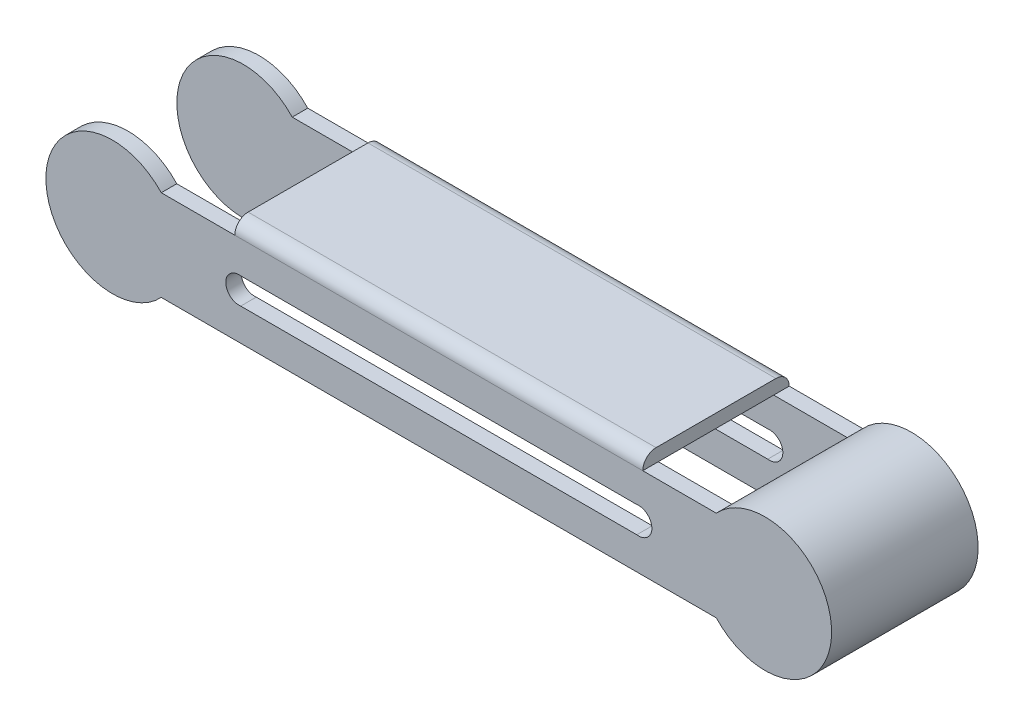
ISO-10303-21;
HEADER;
FILE_DESCRIPTION(('STEP AP214'),'2;1');
FILE_NAME('part.step','',(''),(''),'','','');
FILE_SCHEMA(('AUTOMOTIVE_DESIGN { 1 0 10303 214 1 1 1 1 }'));
ENDSEC;
DATA;
#1=APPLICATION_CONTEXT('core data for automotive mechanical design processes');
#2=APPLICATION_PROTOCOL_DEFINITION('international standard','automotive_design',2000,#1);
#3=PRODUCT_CONTEXT('',#1,'mechanical');
#4=PRODUCT('Part','Part','',(#3));
#5=PRODUCT_RELATED_PRODUCT_CATEGORY('part','',(#4));
#6=PRODUCT_DEFINITION_FORMATION('','',#4);
#7=PRODUCT_DEFINITION_CONTEXT('part definition',#1,'design');
#8=PRODUCT_DEFINITION('design','',#6,#7);
#9=PRODUCT_DEFINITION_SHAPE('','',#8);
#10=(LENGTH_UNIT() NAMED_UNIT(*) SI_UNIT(.MILLI.,.METRE.));
#11=(NAMED_UNIT(*) PLANE_ANGLE_UNIT() SI_UNIT($,.RADIAN.));
#12=(NAMED_UNIT(*) SI_UNIT($,.STERADIAN.) SOLID_ANGLE_UNIT());
#13=UNCERTAINTY_MEASURE_WITH_UNIT(LENGTH_MEASURE(1.E-05),#10,'distance_accuracy_value','');
#14=(GEOMETRIC_REPRESENTATION_CONTEXT(3) GLOBAL_UNCERTAINTY_ASSIGNED_CONTEXT((#13)) GLOBAL_UNIT_ASSIGNED_CONTEXT((#10,
#11,#12)) REPRESENTATION_CONTEXT('',''));
#15=CARTESIAN_POINT('',(0.,0.,0.));
#16=DIRECTION('',(0.,0.,1.));
#17=DIRECTION('',(1.,0.,0.));
#18=AXIS2_PLACEMENT_3D('',#15,#16,#17);
#19=CARTESIAN_POINT('',(73.5,0.,0.));
#20=DIRECTION('',(0.,0.,1.));
#21=DIRECTION('',(1.,0.,0.));
#22=AXIS2_PLACEMENT_3D('',#19,#20,#21);
#23=PLANE('',#22);
#24=DIRECTION('',(-1.,0.,0.));
#25=VECTOR('',#24,1.);
#26=CARTESIAN_POINT('',(73.5,2.95,0.));
#27=LINE('',#26,#25);
#28=CARTESIAN_POINT('',(44.6061096592177,2.95,0.));
#29=VERTEX_POINT('',#28);
#30=CARTESIAN_POINT('',(-44.6061096592177,2.95,0.));
#31=VERTEX_POINT('',#30);
#32=EDGE_CURVE('E283',#29,#31,#27,.T.);
#33=ORIENTED_EDGE('',*,*,#32,.T.);
#34=CARTESIAN_POINT('',(-45.,0.,0.));
#35=DIRECTION('',(0.,0.,1.));
#36=DIRECTION('',(1.,0.,0.));
#37=AXIS2_PLACEMENT_3D('',#34,#35,#36);
#38=CIRCLE('',#37,2.97618037097244);
#39=CARTESIAN_POINT('',(-44.6061096592177,-2.95,0.));
#40=VERTEX_POINT('',#39);
#41=EDGE_CURVE('E279',#31,#40,#38,.T.);
#42=ORIENTED_EDGE('',*,*,#41,.T.);
#43=DIRECTION('',(1.,0.,0.));
#44=VECTOR('',#43,1.);
#45=CARTESIAN_POINT('',(73.5,-2.95,0.));
#46=LINE('',#45,#44);
#47=CARTESIAN_POINT('',(44.6061096592177,-2.95,0.));
#48=VERTEX_POINT('',#47);
#49=EDGE_CURVE('E291',#40,#48,#46,.T.);
#50=ORIENTED_EDGE('',*,*,#49,.T.);
#51=CARTESIAN_POINT('',(45.0278915933969,0.,0.));
#52=DIRECTION('',(0.,0.,1.));
#53=DIRECTION('',(1.,0.,0.));
#54=AXIS2_PLACEMENT_3D('',#51,#52,#53);
#55=CIRCLE('',#54,2.98);
#56=EDGE_CURVE('E287',#48,#29,#55,.T.);
#57=ORIENTED_EDGE('',*,*,#56,.T.);
#58=EDGE_LOOP('',(#33,#42,#50,#57));
#59=FACE_BOUND('',#58,.T.);
#60=DIRECTION('',(-1.,0.,0.));
#61=VECTOR('',#60,1.);
#62=CARTESIAN_POINT('',(73.5,10.2119473962557,0.));
#63=LINE('',#62,#61);
#64=CARTESIAN_POINT('',(45.9493952932151,10.2119473962557,0.));
#65=VERTEX_POINT('',#64);
#66=CARTESIAN_POINT('',(-45.9493952932151,10.2119473962557,0.));
#67=VERTEX_POINT('',#66);
#68=EDGE_CURVE('E195',#65,#67,#63,.T.);
#69=ORIENTED_EDGE('',*,*,#68,.F.);
#70=DIRECTION('',(-1.,0.,0.));
#71=VECTOR('',#70,1.);
#72=CARTESIAN_POINT('',(-62.5129107414154,10.2119473962557,0.));
#73=LINE('',#72,#71);
#74=CARTESIAN_POINT('',(62.5129107414154,10.2119473962557,0.));
#75=VERTEX_POINT('',#74);
#76=EDGE_CURVE('E199',#75,#65,#73,.T.);
#77=ORIENTED_EDGE('',*,*,#76,.F.);
#78=CARTESIAN_POINT('',(73.5,0.,0.));
#79=DIRECTION('',(0.,0.,1.));
#80=DIRECTION('',(1.,0.,0.));
#81=AXIS2_PLACEMENT_3D('',#78,#79,#80);
#82=CIRCLE('',#81,15.);
#83=CARTESIAN_POINT('',(62.5129107414154,-10.2119473962557,0.));
#84=VERTEX_POINT('',#83);
#85=EDGE_CURVE('E321',#84,#75,#82,.T.);
#86=ORIENTED_EDGE('',*,*,#85,.F.);
#87=DIRECTION('',(1.,0.,0.));
#88=VECTOR('',#87,1.);
#89=CARTESIAN_POINT('',(-62.5129107414154,-10.2119473962557,0.));
#90=LINE('',#89,#88);
#91=CARTESIAN_POINT('',(-62.5129107414154,-10.2119473962557,0.));
#92=VERTEX_POINT('',#91);
#93=EDGE_CURVE('E314',#92,#84,#90,.T.);
#94=ORIENTED_EDGE('',*,*,#93,.F.);
#95=CARTESIAN_POINT('',(-73.5,0.,0.));
#96=DIRECTION('',(0.,0.,1.));
#97=DIRECTION('',(1.,0.,0.));
#98=AXIS2_PLACEMENT_3D('',#95,#96,#97);
#99=CIRCLE('',#98,15.);
#100=CARTESIAN_POINT('',(-62.5129107414154,10.2119473962557,0.));
#101=VERTEX_POINT('',#100);
#102=EDGE_CURVE('E227',#101,#92,#99,.T.);
#103=ORIENTED_EDGE('',*,*,#102,.F.);
#104=EDGE_CURVE('E202',#67,#101,#73,.T.);
#105=ORIENTED_EDGE('',*,*,#104,.F.);
#106=EDGE_LOOP('',(#69,#77,#86,#94,#103,#105));
#107=FACE_BOUND('',#106,.T.);
#108=ADVANCED_FACE('F43',(#59,#107),#23,.F.);
#109=CARTESIAN_POINT('',(73.5,0.,33.));
#110=DIRECTION('',(0.,0.,1.));
#111=DIRECTION('',(1.,0.,0.));
#112=AXIS2_PLACEMENT_3D('',#109,#110,#111);
#113=PLANE('',#112);
#114=CARTESIAN_POINT('',(-45.,0.,33.));
#115=DIRECTION('',(0.,0.,1.));
#116=DIRECTION('',(1.,0.,0.));
#117=AXIS2_PLACEMENT_3D('',#114,#115,#116);
#118=CIRCLE('',#117,2.97618037097244);
#119=CARTESIAN_POINT('',(-44.6061096592177,2.95,33.));
#120=VERTEX_POINT('',#119);
#121=CARTESIAN_POINT('',(-44.6061096592177,-2.95,33.));
#122=VERTEX_POINT('',#121);
#123=EDGE_CURVE('E324',#120,#122,#118,.T.);
#124=ORIENTED_EDGE('',*,*,#123,.F.);
#125=DIRECTION('',(-1.,0.,0.));
#126=VECTOR('',#125,1.);
#127=CARTESIAN_POINT('',(73.5,2.95,33.));
#128=LINE('',#127,#126);
#129=CARTESIAN_POINT('',(44.6061096592177,2.95,33.));
#130=VERTEX_POINT('',#129);
#131=EDGE_CURVE('E335',#130,#120,#128,.T.);
#132=ORIENTED_EDGE('',*,*,#131,.F.);
#133=CARTESIAN_POINT('',(45.0278915933969,0.,33.));
#134=DIRECTION('',(0.,0.,1.));
#135=DIRECTION('',(1.,0.,0.));
#136=AXIS2_PLACEMENT_3D('',#133,#134,#135);
#137=CIRCLE('',#136,2.98);
#138=CARTESIAN_POINT('',(44.6061096592177,-2.95,33.));
#139=VERTEX_POINT('',#138);
#140=EDGE_CURVE('E339',#139,#130,#137,.T.);
#141=ORIENTED_EDGE('',*,*,#140,.F.);
#142=DIRECTION('',(1.,0.,0.));
#143=VECTOR('',#142,1.);
#144=CARTESIAN_POINT('',(73.5,-2.95,33.));
#145=LINE('',#144,#143);
#146=EDGE_CURVE('E343',#122,#139,#145,.T.);
#147=ORIENTED_EDGE('',*,*,#146,.F.);
#148=EDGE_LOOP('',(#124,#132,#141,#147));
#149=FACE_BOUND('',#148,.T.);
#150=DIRECTION('',(-1.,0.,0.));
#151=VECTOR('',#150,1.);
#152=CARTESIAN_POINT('',(-62.5129107414154,10.2119473962557,33.));
#153=LINE('',#152,#151);
#154=CARTESIAN_POINT('',(62.5129107414154,10.2119473962557,33.));
#155=VERTEX_POINT('',#154);
#156=CARTESIAN_POINT('',(45.9493952932151,10.2119473962557,33.));
#157=VERTEX_POINT('',#156);
#158=EDGE_CURVE('E252',#155,#157,#153,.T.);
#159=ORIENTED_EDGE('',*,*,#158,.T.);
#160=DIRECTION('',(-1.,0.,0.));
#161=VECTOR('',#160,1.);
#162=CARTESIAN_POINT('',(73.5,10.2119473962557,33.));
#163=LINE('',#162,#161);
#164=CARTESIAN_POINT('',(-45.9493952932151,10.2119473962557,33.));
#165=VERTEX_POINT('',#164);
#166=EDGE_CURVE('E206',#157,#165,#163,.T.);
#167=ORIENTED_EDGE('',*,*,#166,.T.);
#168=CARTESIAN_POINT('',(-62.5129107414154,10.2119473962557,33.));
#169=VERTEX_POINT('',#168);
#170=EDGE_CURVE('E265',#165,#169,#153,.T.);
#171=ORIENTED_EDGE('',*,*,#170,.T.);
#172=CARTESIAN_POINT('',(-73.5,0.,33.));
#173=DIRECTION('',(0.,0.,1.));
#174=DIRECTION('',(1.,0.,0.));
#175=AXIS2_PLACEMENT_3D('',#172,#173,#174);
#176=CIRCLE('',#175,15.);
#177=CARTESIAN_POINT('',(-62.5129107414154,-10.2119473962557,33.));
#178=VERTEX_POINT('',#177);
#179=EDGE_CURVE('E264',#169,#178,#176,.T.);
#180=ORIENTED_EDGE('',*,*,#179,.T.);
#181=DIRECTION('',(1.,0.,0.));
#182=VECTOR('',#181,1.);
#183=CARTESIAN_POINT('',(-62.5129107414154,-10.2119473962557,33.));
#184=LINE('',#183,#182);
#185=CARTESIAN_POINT('',(62.5129107414154,-10.2119473962557,33.));
#186=VERTEX_POINT('',#185);
#187=EDGE_CURVE('E325',#178,#186,#184,.T.);
#188=ORIENTED_EDGE('',*,*,#187,.T.);
#189=CARTESIAN_POINT('',(73.5,0.,33.));
#190=DIRECTION('',(0.,0.,1.));
#191=DIRECTION('',(1.,0.,0.));
#192=AXIS2_PLACEMENT_3D('',#189,#190,#191);
#193=CIRCLE('',#192,15.);
#194=EDGE_CURVE('E261',#186,#155,#193,.T.);
#195=ORIENTED_EDGE('',*,*,#194,.T.);
#196=EDGE_LOOP('',(#159,#167,#171,#180,#188,#195));
#197=FACE_BOUND('',#196,.T.);
#198=ADVANCED_FACE('F259',(#149,#197),#113,.T.);
#199=CARTESIAN_POINT('',(-62.5129107414154,10.2119473962557,33.));
#200=DIRECTION('',(0.,-1.,0.));
#201=DIRECTION('',(0.,0.,-1.));
#202=AXIS2_PLACEMENT_3D('',#199,#200,#201);
#203=PLANE('',#202);
#204=DIRECTION('',(0.,0.,-1.));
#205=VECTOR('',#204,1.);
#206=CARTESIAN_POINT('',(45.9493952932151,10.2119473962557,0.));
#207=LINE('',#206,#205);
#208=CARTESIAN_POINT('',(45.9493952932151,10.2119473962557,29.5));
#209=VERTEX_POINT('',#208);
#210=EDGE_CURVE('E222',#157,#209,#207,.T.);
#211=ORIENTED_EDGE('',*,*,#210,.F.);
#212=ORIENTED_EDGE('',*,*,#158,.F.);
#213=DIRECTION('',(0.,0.,-1.));
#214=VECTOR('',#213,1.);
#215=CARTESIAN_POINT('',(62.5129107414154,10.2119473962557,33.));
#216=LINE('',#215,#214);
#217=CARTESIAN_POINT('',(62.5129107414154,10.2119473962557,29.5));
#218=VERTEX_POINT('',#217);
#219=EDGE_CURVE('E295',#155,#218,#216,.T.);
#220=ORIENTED_EDGE('',*,*,#219,.T.);
#221=DIRECTION('',(1.,0.,0.));
#222=VECTOR('',#221,1.);
#223=CARTESIAN_POINT('',(-62.5129107414154,10.2119473962557,29.5));
#224=LINE('',#223,#222);
#225=EDGE_CURVE('E254',#209,#218,#224,.T.);
#226=ORIENTED_EDGE('',*,*,#225,.F.);
#227=EDGE_LOOP('',(#211,#212,#220,#226));
#228=FACE_BOUND('',#227,.T.);
#229=ADVANCED_FACE('F250',(#228),#203,.F.);
#230=DIRECTION('',(0.,0.,1.));
#231=VECTOR('',#230,1.);
#232=CARTESIAN_POINT('',(-45.9493952932151,10.2119473962557,0.));
#233=LINE('',#232,#231);
#234=CARTESIAN_POINT('',(-45.9493952932151,10.2119473962557,29.5));
#235=VERTEX_POINT('',#234);
#236=EDGE_CURVE('E257',#235,#165,#233,.T.);
#237=ORIENTED_EDGE('',*,*,#236,.F.);
#238=CARTESIAN_POINT('',(-62.5129107414154,10.2119473962557,29.5));
#239=VERTEX_POINT('',#238);
#240=EDGE_CURVE('E403',#239,#235,#224,.T.);
#241=ORIENTED_EDGE('',*,*,#240,.F.);
#242=DIRECTION('',(0.,0.,-1.));
#243=VECTOR('',#242,1.);
#244=CARTESIAN_POINT('',(-62.5129107414154,10.2119473962557,33.));
#245=LINE('',#244,#243);
#246=EDGE_CURVE('E298',#169,#239,#245,.T.);
#247=ORIENTED_EDGE('',*,*,#246,.F.);
#248=ORIENTED_EDGE('',*,*,#170,.F.);
#249=EDGE_LOOP('',(#237,#241,#247,#248));
#250=FACE_BOUND('',#249,.T.);
#251=ADVANCED_FACE('F494',(#250),#203,.F.);
#252=CARTESIAN_POINT('',(45.9493952932151,10.2119473962557,3.5));
#253=VERTEX_POINT('',#252);
#254=EDGE_CURVE('E211',#253,#65,#207,.T.);
#255=ORIENTED_EDGE('',*,*,#254,.F.);
#256=DIRECTION('',(-1.,0.,0.));
#257=VECTOR('',#256,1.);
#258=CARTESIAN_POINT('',(-62.5129107414154,10.2119473962557,3.5));
#259=LINE('',#258,#257);
#260=CARTESIAN_POINT('',(62.5129107414154,10.2119473962557,3.5));
#261=VERTEX_POINT('',#260);
#262=EDGE_CURVE('E410',#261,#253,#259,.T.);
#263=ORIENTED_EDGE('',*,*,#262,.F.);
#264=EDGE_CURVE('E225',#261,#75,#216,.T.);
#265=ORIENTED_EDGE('',*,*,#264,.T.);
#266=ORIENTED_EDGE('',*,*,#76,.T.);
#267=EDGE_LOOP('',(#255,#263,#265,#266));
#268=FACE_BOUND('',#267,.T.);
#269=ADVANCED_FACE('F223',(#268),#203,.F.);
#270=CARTESIAN_POINT('',(-45.9493952932151,10.2119473962557,3.5));
#271=VERTEX_POINT('',#270);
#272=EDGE_CURVE('E430',#67,#271,#233,.T.);
#273=ORIENTED_EDGE('',*,*,#272,.F.);
#274=ORIENTED_EDGE('',*,*,#104,.T.);
#275=CARTESIAN_POINT('',(-62.5129107414154,10.2119473962557,3.5));
#276=VERTEX_POINT('',#275);
#277=EDGE_CURVE('E302',#276,#101,#245,.T.);
#278=ORIENTED_EDGE('',*,*,#277,.F.);
#279=EDGE_CURVE('E414',#271,#276,#259,.T.);
#280=ORIENTED_EDGE('',*,*,#279,.F.);
#281=EDGE_LOOP('',(#273,#274,#278,#280));
#282=FACE_BOUND('',#281,.T.);
#283=ADVANCED_FACE('F444',(#282),#203,.F.);
#284=CARTESIAN_POINT('',(-73.5,0.,33.));
#285=DIRECTION('',(0.,0.,-1.));
#286=DIRECTION('',(-1.,0.,0.));
#287=AXIS2_PLACEMENT_3D('',#284,#285,#286);
#288=CYLINDRICAL_SURFACE('',#287,15.);
#289=ORIENTED_EDGE('',*,*,#246,.T.);
#290=CARTESIAN_POINT('',(-73.5,0.,29.5));
#291=DIRECTION('',(0.,0.,1.));
#292=DIRECTION('',(1.,0.,0.));
#293=AXIS2_PLACEMENT_3D('',#290,#291,#292);
#294=CIRCLE('',#293,15.);
#295=CARTESIAN_POINT('',(-62.5129107414154,-10.2119473962557,29.5));
#296=VERTEX_POINT('',#295);
#297=EDGE_CURVE('E423',#239,#296,#294,.T.);
#298=ORIENTED_EDGE('',*,*,#297,.T.);
#299=DIRECTION('',(0.,0.,-1.));
#300=VECTOR('',#299,1.);
#301=CARTESIAN_POINT('',(-62.5129107414154,-10.2119473962557,33.));
#302=LINE('',#301,#300);
#303=EDGE_CURVE('E303',#178,#296,#302,.T.);
#304=ORIENTED_EDGE('',*,*,#303,.F.);
#305=ORIENTED_EDGE('',*,*,#179,.F.);
#306=EDGE_LOOP('',(#289,#298,#304,#305));
#307=FACE_BOUND('',#306,.T.);
#308=ADVANCED_FACE('F500',(#307),#288,.T.);
#309=CARTESIAN_POINT('',(-62.5129107414154,-10.2119473962557,33.));
#310=DIRECTION('',(0.,1.,0.));
#311=DIRECTION('',(0.,0.,1.));
#312=AXIS2_PLACEMENT_3D('',#309,#310,#311);
#313=PLANE('',#312);
#314=ORIENTED_EDGE('',*,*,#303,.T.);
#315=DIRECTION('',(1.,0.,0.));
#316=VECTOR('',#315,1.);
#317=CARTESIAN_POINT('',(-62.5129107414154,-10.2119473962557,29.5));
#318=LINE('',#317,#316);
#319=CARTESIAN_POINT('',(62.5129107414154,-10.2119473962557,29.5));
#320=VERTEX_POINT('',#319);
#321=EDGE_CURVE('E367',#296,#320,#318,.T.);
#322=ORIENTED_EDGE('',*,*,#321,.T.);
#323=DIRECTION('',(0.,0.,-1.));
#324=VECTOR('',#323,1.);
#325=CARTESIAN_POINT('',(62.5129107414154,-10.2119473962557,33.));
#326=LINE('',#325,#324);
#327=EDGE_CURVE('E308',#186,#320,#326,.T.);
#328=ORIENTED_EDGE('',*,*,#327,.F.);
#329=ORIENTED_EDGE('',*,*,#187,.F.);
#330=EDGE_LOOP('',(#314,#322,#328,#329));
#331=FACE_BOUND('',#330,.T.);
#332=ADVANCED_FACE('F483',(#331),#313,.F.);
#333=CARTESIAN_POINT('',(-45.,0.,-17.));
#334=DIRECTION('',(0.,0.,1.));
#335=DIRECTION('',(1.,0.,0.));
#336=AXIS2_PLACEMENT_3D('',#333,#334,#335);
#337=CYLINDRICAL_SURFACE('',#336,2.97618037097244);
#338=DIRECTION('',(0.,0.,1.));
#339=VECTOR('',#338,1.);
#340=CARTESIAN_POINT('',(-44.6061096592177,-2.95,-17.));
#341=LINE('',#340,#339);
#342=CARTESIAN_POINT('',(-44.6061096592177,-2.95,29.5));
#343=VERTEX_POINT('',#342);
#344=EDGE_CURVE('E353',#343,#122,#341,.T.);
#345=ORIENTED_EDGE('',*,*,#344,.F.);
#346=CARTESIAN_POINT('',(-45.,0.,29.5));
#347=DIRECTION('',(0.,0.,1.));
#348=DIRECTION('',(1.,0.,0.));
#349=AXIS2_PLACEMENT_3D('',#346,#347,#348);
#350=CIRCLE('',#349,2.97618037097244);
#351=CARTESIAN_POINT('',(-44.6061096592177,2.95,29.5));
#352=VERTEX_POINT('',#351);
#353=EDGE_CURVE('E371',#343,#352,#350,.F.);
#354=ORIENTED_EDGE('',*,*,#353,.T.);
#355=DIRECTION('',(0.,0.,1.));
#356=VECTOR('',#355,1.);
#357=CARTESIAN_POINT('',(-44.6061096592177,2.95,-17.));
#358=LINE('',#357,#356);
#359=EDGE_CURVE('E363',#352,#120,#358,.T.);
#360=ORIENTED_EDGE('',*,*,#359,.T.);
#361=ORIENTED_EDGE('',*,*,#123,.T.);
#362=EDGE_LOOP('',(#345,#354,#360,#361));
#363=FACE_BOUND('',#362,.T.);
#364=ADVANCED_FACE('F507',(#363),#337,.F.);
#365=CARTESIAN_POINT('',(44.6061096592177,2.95,-17.));
#366=DIRECTION('',(0.,1.,0.));
#367=DIRECTION('',(0.,0.,1.));
#368=AXIS2_PLACEMENT_3D('',#365,#366,#367);
#369=PLANE('',#368);
#370=ORIENTED_EDGE('',*,*,#359,.F.);
#371=DIRECTION('',(1.,0.,0.));
#372=VECTOR('',#371,1.);
#373=CARTESIAN_POINT('',(44.6061096592177,2.95,29.5));
#374=LINE('',#373,#372);
#375=CARTESIAN_POINT('',(44.6061096592177,2.95,29.5));
#376=VERTEX_POINT('',#375);
#377=EDGE_CURVE('E375',#352,#376,#374,.T.);
#378=ORIENTED_EDGE('',*,*,#377,.T.);
#379=DIRECTION('',(0.,0.,1.));
#380=VECTOR('',#379,1.);
#381=CARTESIAN_POINT('',(44.6061096592177,2.95,-17.));
#382=LINE('',#381,#380);
#383=EDGE_CURVE('E358',#376,#130,#382,.T.);
#384=ORIENTED_EDGE('',*,*,#383,.T.);
#385=ORIENTED_EDGE('',*,*,#131,.T.);
#386=EDGE_LOOP('',(#370,#378,#384,#385));
#387=FACE_BOUND('',#386,.T.);
#388=ADVANCED_FACE('F533',(#387),#369,.F.);
#389=CARTESIAN_POINT('',(45.0278915933969,0.,-17.));
#390=DIRECTION('',(0.,0.,1.));
#391=DIRECTION('',(1.,0.,0.));
#392=AXIS2_PLACEMENT_3D('',#389,#390,#391);
#393=CYLINDRICAL_SURFACE('',#392,2.98);
#394=ORIENTED_EDGE('',*,*,#383,.F.);
#395=CARTESIAN_POINT('',(45.0278915933969,0.,29.5));
#396=DIRECTION('',(0.,0.,1.));
#397=DIRECTION('',(1.,0.,0.));
#398=AXIS2_PLACEMENT_3D('',#395,#396,#397);
#399=CIRCLE('',#398,2.98);
#400=CARTESIAN_POINT('',(44.6061096592177,-2.95,29.5));
#401=VERTEX_POINT('',#400);
#402=EDGE_CURVE('E379',#376,#401,#399,.F.);
#403=ORIENTED_EDGE('',*,*,#402,.T.);
#404=DIRECTION('',(0.,0.,1.));
#405=VECTOR('',#404,1.);
#406=CARTESIAN_POINT('',(44.6061096592177,-2.95,-17.));
#407=LINE('',#406,#405);
#408=EDGE_CURVE('E352',#401,#139,#407,.T.);
#409=ORIENTED_EDGE('',*,*,#408,.T.);
#410=ORIENTED_EDGE('',*,*,#140,.T.);
#411=EDGE_LOOP('',(#394,#403,#409,#410));
#412=FACE_BOUND('',#411,.T.);
#413=ADVANCED_FACE('F540',(#412),#393,.F.);
#414=CARTESIAN_POINT('',(44.6061096592177,-2.95,-17.));
#415=DIRECTION('',(0.,-1.,0.));
#416=DIRECTION('',(0.,0.,-1.));
#417=AXIS2_PLACEMENT_3D('',#414,#415,#416);
#418=PLANE('',#417);
#419=ORIENTED_EDGE('',*,*,#408,.F.);
#420=DIRECTION('',(-1.,0.,0.));
#421=VECTOR('',#420,1.);
#422=CARTESIAN_POINT('',(44.6061096592177,-2.95,29.5));
#423=LINE('',#422,#421);
#424=EDGE_CURVE('E268',#401,#343,#423,.T.);
#425=ORIENTED_EDGE('',*,*,#424,.T.);
#426=ORIENTED_EDGE('',*,*,#344,.T.);
#427=ORIENTED_EDGE('',*,*,#146,.T.);
#428=EDGE_LOOP('',(#419,#425,#426,#427));
#429=FACE_BOUND('',#428,.T.);
#430=ADVANCED_FACE('F548',(#429),#418,.F.);
#431=CARTESIAN_POINT('',(73.5,0.,33.));
#432=DIRECTION('',(0.,0.,-1.));
#433=DIRECTION('',(-1.,0.,0.));
#434=AXIS2_PLACEMENT_3D('',#431,#432,#433);
#435=CYLINDRICAL_SURFACE('',#434,15.);
#436=ORIENTED_EDGE('',*,*,#85,.T.);
#437=ORIENTED_EDGE('',*,*,#264,.F.);
#438=DIRECTION('',(0.,0.,-1.));
#439=VECTOR('',#438,1.);
#440=CARTESIAN_POINT('',(62.5129107414154,10.2119473962557,3.5));
#441=LINE('',#440,#439);
#442=EDGE_CURVE('E415',#218,#261,#441,.T.);
#443=ORIENTED_EDGE('',*,*,#442,.F.);
#444=ORIENTED_EDGE('',*,*,#219,.F.);
#445=ORIENTED_EDGE('',*,*,#194,.F.);
#446=ORIENTED_EDGE('',*,*,#327,.T.);
#447=CARTESIAN_POINT('',(62.5129107414154,-10.2119473962557,3.5));
#448=VERTEX_POINT('',#447);
#449=EDGE_CURVE('E312',#320,#448,#326,.T.);
#450=ORIENTED_EDGE('',*,*,#449,.T.);
#451=EDGE_CURVE('E313',#448,#84,#326,.T.);
#452=ORIENTED_EDGE('',*,*,#451,.T.);
#453=EDGE_LOOP('',(#436,#437,#443,#444,#445,#446,#450,#452));
#454=FACE_BOUND('',#453,.T.);
#455=ADVANCED_FACE('F479',(#454),#435,.T.);
#456=CARTESIAN_POINT('',(-62.5129107414154,-10.2119473962557,3.5));
#457=VERTEX_POINT('',#456);
#458=EDGE_CURVE('E307',#457,#92,#302,.T.);
#459=ORIENTED_EDGE('',*,*,#458,.F.);
#460=CARTESIAN_POINT('',(-73.5,0.,3.5));
#461=DIRECTION('',(0.,0.,-1.));
#462=DIRECTION('',(-1.,0.,0.));
#463=AXIS2_PLACEMENT_3D('',#460,#461,#462);
#464=CIRCLE('',#463,15.);
#465=EDGE_CURVE('E419',#457,#276,#464,.T.);
#466=ORIENTED_EDGE('',*,*,#465,.T.);
#467=ORIENTED_EDGE('',*,*,#277,.T.);
#468=ORIENTED_EDGE('',*,*,#102,.T.);
#469=EDGE_LOOP('',(#459,#466,#467,#468));
#470=FACE_BOUND('',#469,.T.);
#471=ADVANCED_FACE('F468',(#470),#288,.T.);
#472=ORIENTED_EDGE('',*,*,#451,.F.);
#473=DIRECTION('',(-1.,0.,0.));
#474=VECTOR('',#473,1.);
#475=CARTESIAN_POINT('',(-62.5129107414154,-10.2119473962557,3.5));
#476=LINE('',#475,#474);
#477=EDGE_CURVE('E383',#448,#457,#476,.T.);
#478=ORIENTED_EDGE('',*,*,#477,.T.);
#479=ORIENTED_EDGE('',*,*,#458,.T.);
#480=ORIENTED_EDGE('',*,*,#93,.T.);
#481=EDGE_LOOP('',(#472,#478,#479,#480));
#482=FACE_BOUND('',#481,.T.);
#483=ADVANCED_FACE('F472',(#482),#313,.F.);
#484=CARTESIAN_POINT('',(-44.6061096592177,2.95,3.5));
#485=VERTEX_POINT('',#484);
#486=EDGE_CURVE('E347',#31,#485,#358,.T.);
#487=ORIENTED_EDGE('',*,*,#486,.T.);
#488=CARTESIAN_POINT('',(-45.,0.,3.5));
#489=DIRECTION('',(0.,0.,-1.));
#490=DIRECTION('',(-1.,0.,0.));
#491=AXIS2_PLACEMENT_3D('',#488,#489,#490);
#492=CIRCLE('',#491,2.97618037097244);
#493=CARTESIAN_POINT('',(-44.6061096592177,-2.95,3.5));
#494=VERTEX_POINT('',#493);
#495=EDGE_CURVE('E387',#485,#494,#492,.F.);
#496=ORIENTED_EDGE('',*,*,#495,.T.);
#497=EDGE_CURVE('E348',#40,#494,#341,.T.);
#498=ORIENTED_EDGE('',*,*,#497,.F.);
#499=ORIENTED_EDGE('',*,*,#41,.F.);
#500=EDGE_LOOP('',(#487,#496,#498,#499));
#501=FACE_BOUND('',#500,.T.);
#502=ADVANCED_FACE('F521',(#501),#337,.F.);
#503=CARTESIAN_POINT('',(44.6061096592177,2.95,3.5));
#504=VERTEX_POINT('',#503);
#505=EDGE_CURVE('E359',#29,#504,#382,.T.);
#506=ORIENTED_EDGE('',*,*,#505,.T.);
#507=DIRECTION('',(-1.,0.,0.));
#508=VECTOR('',#507,1.);
#509=CARTESIAN_POINT('',(44.6061096592177,2.95,3.5));
#510=LINE('',#509,#508);
#511=EDGE_CURVE('E391',#504,#485,#510,.T.);
#512=ORIENTED_EDGE('',*,*,#511,.T.);
#513=ORIENTED_EDGE('',*,*,#486,.F.);
#514=ORIENTED_EDGE('',*,*,#32,.F.);
#515=EDGE_LOOP('',(#506,#512,#513,#514));
#516=FACE_BOUND('',#515,.T.);
#517=ADVANCED_FACE('F525',(#516),#369,.F.);
#518=CARTESIAN_POINT('',(44.6061096592177,-2.95,3.49999999999999));
#519=VERTEX_POINT('',#518);
#520=EDGE_CURVE('E354',#48,#519,#407,.T.);
#521=ORIENTED_EDGE('',*,*,#520,.T.);
#522=CARTESIAN_POINT('',(45.0278915933969,0.,3.5));
#523=DIRECTION('',(0.,0.,-1.));
#524=DIRECTION('',(-1.,0.,0.));
#525=AXIS2_PLACEMENT_3D('',#522,#523,#524);
#526=CIRCLE('',#525,2.98);
#527=EDGE_CURVE('E395',#519,#504,#526,.F.);
#528=ORIENTED_EDGE('',*,*,#527,.T.);
#529=ORIENTED_EDGE('',*,*,#505,.F.);
#530=ORIENTED_EDGE('',*,*,#56,.F.);
#531=EDGE_LOOP('',(#521,#528,#529,#530));
#532=FACE_BOUND('',#531,.T.);
#533=ADVANCED_FACE('F530',(#532),#393,.F.);
#534=ORIENTED_EDGE('',*,*,#497,.T.);
#535=DIRECTION('',(1.,0.,0.));
#536=VECTOR('',#535,1.);
#537=CARTESIAN_POINT('',(44.6061096592177,-2.95,3.5));
#538=LINE('',#537,#536);
#539=EDGE_CURVE('E273',#494,#519,#538,.T.);
#540=ORIENTED_EDGE('',*,*,#539,.T.);
#541=ORIENTED_EDGE('',*,*,#520,.F.);
#542=ORIENTED_EDGE('',*,*,#49,.F.);
#543=EDGE_LOOP('',(#534,#540,#541,#542));
#544=FACE_BOUND('',#543,.T.);
#545=ADVANCED_FACE('F559',(#544),#418,.F.);
#546=CARTESIAN_POINT('',(62.5129107414154,-14.7880526037443,3.5));
#547=DIRECTION('',(1.,0.,0.));
#548=DIRECTION('',(0.,1.,0.));
#549=AXIS2_PLACEMENT_3D('',#546,#547,#548);
#550=PLANE('',#549);
#551=DIRECTION('',(0.,1.,0.));
#552=VECTOR('',#551,1.);
#553=CARTESIAN_POINT('',(62.5129107414154,-14.7880526037443,29.5));
#554=LINE('',#553,#552);
#555=EDGE_CURVE('E399',#320,#218,#554,.T.);
#556=ORIENTED_EDGE('',*,*,#555,.T.);
#557=ORIENTED_EDGE('',*,*,#442,.T.);
#558=DIRECTION('',(0.,1.,0.));
#559=VECTOR('',#558,1.);
#560=CARTESIAN_POINT('',(62.5129107414154,-14.7880526037443,3.5));
#561=LINE('',#560,#559);
#562=EDGE_CURVE('E400',#448,#261,#561,.T.);
#563=ORIENTED_EDGE('',*,*,#562,.F.);
#564=ORIENTED_EDGE('',*,*,#449,.F.);
#565=EDGE_LOOP('',(#556,#557,#563,#564));
#566=FACE_BOUND('',#565,.T.);
#567=ADVANCED_FACE('F475',(#566),#550,.F.);
#568=CARTESIAN_POINT('',(-62.5129107414154,-14.7880526037443,29.5));
#569=DIRECTION('',(0.,0.,1.));
#570=DIRECTION('',(1.,0.,0.));
#571=AXIS2_PLACEMENT_3D('',#568,#569,#570);
#572=PLANE('',#571);
#573=ORIENTED_EDGE('',*,*,#424,.F.);
#574=ORIENTED_EDGE('',*,*,#402,.F.);
#575=ORIENTED_EDGE('',*,*,#377,.F.);
#576=ORIENTED_EDGE('',*,*,#353,.F.);
#577=EDGE_LOOP('',(#573,#574,#575,#576));
#578=FACE_BOUND('',#577,.T.);
#579=ORIENTED_EDGE('',*,*,#321,.F.);
#580=ORIENTED_EDGE('',*,*,#297,.F.);
#581=ORIENTED_EDGE('',*,*,#240,.T.);
#582=DIRECTION('',(-1.,0.,0.));
#583=VECTOR('',#582,1.);
#584=CARTESIAN_POINT('',(-62.5129107414154,10.2119473962557,29.5));
#585=LINE('',#584,#583);
#586=EDGE_CURVE('E426',#209,#235,#585,.T.);
#587=ORIENTED_EDGE('',*,*,#586,.F.);
#588=ORIENTED_EDGE('',*,*,#225,.T.);
#589=ORIENTED_EDGE('',*,*,#555,.F.);
#590=EDGE_LOOP('',(#579,#580,#581,#587,#588,#589));
#591=FACE_BOUND('',#590,.T.);
#592=ADVANCED_FACE('F487',(#578,#591),#572,.F.);
#593=CARTESIAN_POINT('',(-62.5129107414154,-14.7880526037443,3.5));
#594=DIRECTION('',(0.,0.,-1.));
#595=DIRECTION('',(-1.,0.,0.));
#596=AXIS2_PLACEMENT_3D('',#593,#594,#595);
#597=PLANE('',#596);
#598=ORIENTED_EDGE('',*,*,#511,.F.);
#599=ORIENTED_EDGE('',*,*,#527,.F.);
#600=ORIENTED_EDGE('',*,*,#539,.F.);
#601=ORIENTED_EDGE('',*,*,#495,.F.);
#602=EDGE_LOOP('',(#598,#599,#600,#601));
#603=FACE_BOUND('',#602,.T.);
#604=ORIENTED_EDGE('',*,*,#562,.T.);
#605=ORIENTED_EDGE('',*,*,#262,.T.);
#606=EDGE_CURVE('E413',#253,#271,#259,.T.);
#607=ORIENTED_EDGE('',*,*,#606,.T.);
#608=ORIENTED_EDGE('',*,*,#279,.T.);
#609=ORIENTED_EDGE('',*,*,#465,.F.);
#610=ORIENTED_EDGE('',*,*,#477,.F.);
#611=EDGE_LOOP('',(#604,#605,#607,#608,#609,#610));
#612=FACE_BOUND('',#611,.T.);
#613=ADVANCED_FACE('F450',(#603,#612),#597,.F.);
#614=CARTESIAN_POINT('',(0.,10.2119473962557,0.));
#615=DIRECTION('',(0.,1.,0.));
#616=DIRECTION('',(0.,0.,1.));
#617=AXIS2_PLACEMENT_3D('',#614,#615,#616);
#618=PLANE('',#617);
#619=EDGE_CURVE('E216',#209,#253,#207,.T.);
#620=ORIENTED_EDGE('',*,*,#619,.F.);
#621=ORIENTED_EDGE('',*,*,#586,.T.);
#622=EDGE_CURVE('E432',#271,#235,#233,.T.);
#623=ORIENTED_EDGE('',*,*,#622,.F.);
#624=ORIENTED_EDGE('',*,*,#606,.F.);
#625=EDGE_LOOP('',(#620,#621,#623,#624));
#626=FACE_BOUND('',#625,.T.);
#627=ADVANCED_FACE('F489',(#626),#618,.F.);
#628=CARTESIAN_POINT('',(45.9493952932151,13.2119473962557,0.));
#629=DIRECTION('',(-1.,0.,0.));
#630=DIRECTION('',(0.,-1.,0.));
#631=AXIS2_PLACEMENT_3D('',#628,#629,#630);
#632=PLANE('',#631);
#633=ORIENTED_EDGE('',*,*,#254,.T.);
#634=CARTESIAN_POINT('',(45.9493952932151,10.2119473962557,3.));
#635=DIRECTION('',(-1.,0.,0.));
#636=DIRECTION('',(0.,-1.,0.));
#637=AXIS2_PLACEMENT_3D('',#634,#635,#636);
#638=CIRCLE('',#637,3.);
#639=CARTESIAN_POINT('',(45.9493952932151,13.2119473962557,3.));
#640=VERTEX_POINT('',#639);
#641=EDGE_CURVE('E11',#65,#640,#638,.F.);
#642=ORIENTED_EDGE('',*,*,#641,.T.);
#643=DIRECTION('',(0.,0.,-1.));
#644=VECTOR('',#643,1.);
#645=CARTESIAN_POINT('',(45.9493952932151,13.2119473962557,0.));
#646=LINE('',#645,#644);
#647=CARTESIAN_POINT('',(45.9493952932151,13.2119473962557,30.));
#648=VERTEX_POINT('',#647);
#649=EDGE_CURVE('E243',#648,#640,#646,.T.);
#650=ORIENTED_EDGE('',*,*,#649,.F.);
#651=CARTESIAN_POINT('',(45.9493952932151,10.2119473962557,30.));
#652=DIRECTION('',(-1.,0.,0.));
#653=DIRECTION('',(0.,-1.,0.));
#654=AXIS2_PLACEMENT_3D('',#651,#652,#653);
#655=CIRCLE('',#654,3.);
#656=EDGE_CURVE('E52',#648,#157,#655,.F.);
#657=ORIENTED_EDGE('',*,*,#656,.T.);
#658=ORIENTED_EDGE('',*,*,#210,.T.);
#659=ORIENTED_EDGE('',*,*,#619,.T.);
#660=EDGE_LOOP('',(#633,#642,#650,#657,#658,#659));
#661=FACE_BOUND('',#660,.T.);
#662=ADVANCED_FACE('F212',(#661),#632,.F.);
#663=CARTESIAN_POINT('',(-45.9493952932151,13.2119473962557,0.));
#664=DIRECTION('',(1.,0.,0.));
#665=DIRECTION('',(0.,1.,0.));
#666=AXIS2_PLACEMENT_3D('',#663,#664,#665);
#667=PLANE('',#666);
#668=DIRECTION('',(0.,0.,1.));
#669=VECTOR('',#668,1.);
#670=CARTESIAN_POINT('',(-45.9493952932151,13.2119473962557,0.));
#671=LINE('',#670,#669);
#672=CARTESIAN_POINT('',(-45.9493952932151,13.2119473962557,3.));
#673=VERTEX_POINT('',#672);
#674=CARTESIAN_POINT('',(-45.9493952932151,13.2119473962557,30.));
#675=VERTEX_POINT('',#674);
#676=EDGE_CURVE('E429',#673,#675,#671,.T.);
#677=ORIENTED_EDGE('',*,*,#676,.F.);
#678=CARTESIAN_POINT('',(-45.9493952932151,10.2119473962557,3.));
#679=DIRECTION('',(1.,0.,0.));
#680=DIRECTION('',(0.,1.,0.));
#681=AXIS2_PLACEMENT_3D('',#678,#679,#680);
#682=CIRCLE('',#681,3.);
#683=EDGE_CURVE('E67',#673,#67,#682,.F.);
#684=ORIENTED_EDGE('',*,*,#683,.T.);
#685=ORIENTED_EDGE('',*,*,#272,.T.);
#686=ORIENTED_EDGE('',*,*,#622,.T.);
#687=ORIENTED_EDGE('',*,*,#236,.T.);
#688=CARTESIAN_POINT('',(-45.9493952932151,10.2119473962557,30.));
#689=DIRECTION('',(1.,0.,0.));
#690=DIRECTION('',(0.,1.,0.));
#691=AXIS2_PLACEMENT_3D('',#688,#689,#690);
#692=CIRCLE('',#691,3.);
#693=EDGE_CURVE('E59',#165,#675,#692,.F.);
#694=ORIENTED_EDGE('',*,*,#693,.T.);
#695=EDGE_LOOP('',(#677,#684,#685,#686,#687,#694));
#696=FACE_BOUND('',#695,.T.);
#697=ADVANCED_FACE('F438',(#696),#667,.F.);
#698=CARTESIAN_POINT('',(0.,13.2119473962557,0.));
#699=DIRECTION('',(0.,1.,0.));
#700=DIRECTION('',(0.,0.,1.));
#701=AXIS2_PLACEMENT_3D('',#698,#699,#700);
#702=PLANE('',#701);
#703=ORIENTED_EDGE('',*,*,#649,.T.);
#704=DIRECTION('',(-1.,0.,0.));
#705=VECTOR('',#704,1.);
#706=CARTESIAN_POINT('',(-45.9493952932151,13.2119473962557,3.));
#707=LINE('',#706,#705);
#708=EDGE_CURVE('E230',#640,#673,#707,.T.);
#709=ORIENTED_EDGE('',*,*,#708,.T.);
#710=ORIENTED_EDGE('',*,*,#676,.T.);
#711=DIRECTION('',(1.,0.,0.));
#712=VECTOR('',#711,1.);
#713=CARTESIAN_POINT('',(0.,13.2119473962557,30.));
#714=LINE('',#713,#712);
#715=EDGE_CURVE('E205',#675,#648,#714,.T.);
#716=ORIENTED_EDGE('',*,*,#715,.T.);
#717=EDGE_LOOP('',(#703,#709,#710,#716));
#718=FACE_BOUND('',#717,.T.);
#719=ADVANCED_FACE('F437',(#718),#702,.T.);
#720=CARTESIAN_POINT('',(0.,10.2119473962557,3.));
#721=DIRECTION('',(1.,0.,0.));
#722=DIRECTION('',(0.,0.,-1.));
#723=AXIS2_PLACEMENT_3D('',#720,#721,#722);
#724=CYLINDRICAL_SURFACE('',#723,3.);
#725=ORIENTED_EDGE('',*,*,#641,.F.);
#726=ORIENTED_EDGE('',*,*,#68,.T.);
#727=ORIENTED_EDGE('',*,*,#683,.F.);
#728=ORIENTED_EDGE('',*,*,#708,.F.);
#729=EDGE_LOOP('',(#725,#726,#727,#728));
#730=FACE_BOUND('',#729,.T.);
#731=ADVANCED_FACE('F229',(#730),#724,.T.);
#732=CARTESIAN_POINT('',(0.,10.2119473962557,30.));
#733=DIRECTION('',(1.,0.,0.));
#734=DIRECTION('',(0.,0.,-1.));
#735=AXIS2_PLACEMENT_3D('',#732,#733,#734);
#736=CYLINDRICAL_SURFACE('',#735,3.);
#737=ORIENTED_EDGE('',*,*,#693,.F.);
#738=ORIENTED_EDGE('',*,*,#166,.F.);
#739=ORIENTED_EDGE('',*,*,#656,.F.);
#740=ORIENTED_EDGE('',*,*,#715,.F.);
#741=EDGE_LOOP('',(#737,#738,#739,#740));
#742=FACE_BOUND('',#741,.T.);
#743=ADVANCED_FACE('F45',(#742),#736,.T.);
#744=CLOSED_SHELL('',(#108,#198,#229,#251,#269,#283,#308,#332,#364,#388,#413,#430,#455,#471,
#483,#502,#517,#533,#545,#567,#592,#613,#627,#662,#697,#719,#731,#743));
#745=MANIFOLD_SOLID_BREP('B2',#744);
#746=ADVANCED_BREP_SHAPE_REPRESENTATION('',(#18,#745),#14);
#747=SHAPE_DEFINITION_REPRESENTATION(#9,#746);
ENDSEC;
END-ISO-10303-21;
